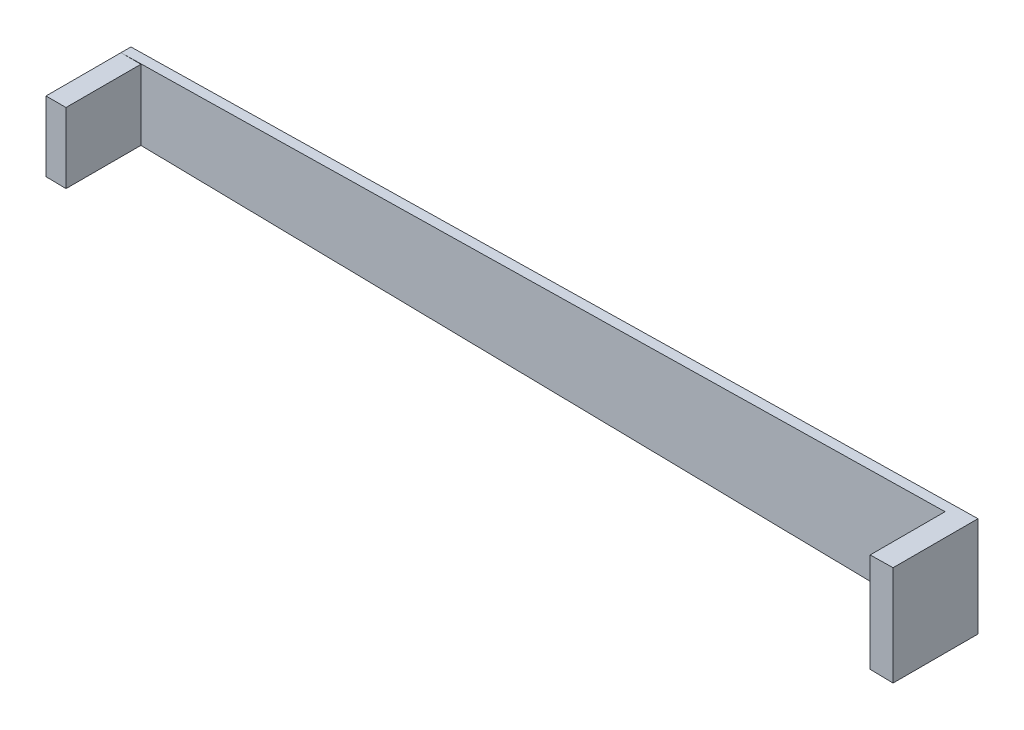
ISO-10303-21;
HEADER;
FILE_DESCRIPTION(('STEP AP214'),'2;1');
FILE_NAME('part.step','',(''),(''),'','','');
FILE_SCHEMA(('AUTOMOTIVE_DESIGN { 1 0 10303 214 1 1 1 1 }'));
ENDSEC;
DATA;
#1=APPLICATION_CONTEXT('core data for automotive mechanical design processes');
#2=APPLICATION_PROTOCOL_DEFINITION('international standard','automotive_design',2000,#1);
#3=PRODUCT_CONTEXT('',#1,'mechanical');
#4=PRODUCT('Part','Part','',(#3));
#5=PRODUCT_RELATED_PRODUCT_CATEGORY('part','',(#4));
#6=PRODUCT_DEFINITION_FORMATION('','',#4);
#7=PRODUCT_DEFINITION_CONTEXT('part definition',#1,'design');
#8=PRODUCT_DEFINITION('design','',#6,#7);
#9=PRODUCT_DEFINITION_SHAPE('','',#8);
#10=(LENGTH_UNIT() NAMED_UNIT(*) SI_UNIT(.MILLI.,.METRE.));
#11=(NAMED_UNIT(*) PLANE_ANGLE_UNIT() SI_UNIT($,.RADIAN.));
#12=(NAMED_UNIT(*) SI_UNIT($,.STERADIAN.) SOLID_ANGLE_UNIT());
#13=UNCERTAINTY_MEASURE_WITH_UNIT(LENGTH_MEASURE(1.E-05),#10,'distance_accuracy_value','');
#14=(GEOMETRIC_REPRESENTATION_CONTEXT(3) GLOBAL_UNCERTAINTY_ASSIGNED_CONTEXT((#13)) GLOBAL_UNIT_ASSIGNED_CONTEXT((#10,
#11,#12)) REPRESENTATION_CONTEXT('',''));
#15=CARTESIAN_POINT('',(0.,0.,0.));
#16=DIRECTION('',(0.,0.,1.));
#17=DIRECTION('',(1.,0.,0.));
#18=AXIS2_PLACEMENT_3D('',#15,#16,#17);
#19=CARTESIAN_POINT('',(0.,0.,2.));
#20=DIRECTION('',(0.,0.,-1.));
#21=DIRECTION('',(-1.,0.,0.));
#22=AXIS2_PLACEMENT_3D('',#19,#20,#21);
#23=PLANE('',#22);
#24=DIRECTION('',(0.,-1.,0.));
#25=VECTOR('',#24,1.);
#26=CARTESIAN_POINT('',(95.1600000000001,0.,2.));
#27=LINE('',#26,#25);
#28=CARTESIAN_POINT('',(95.1600000000001,9.9187969924812,2.));
#29=VERTEX_POINT('',#28);
#30=CARTESIAN_POINT('',(95.1600000000002,-9.91879699248121,2.));
#31=VERTEX_POINT('',#30);
#32=EDGE_CURVE('E57',#29,#31,#27,.T.);
#33=ORIENTED_EDGE('',*,*,#32,.F.);
#34=DIRECTION('',(-0.9998435459059,-0.0176885191668447,0.));
#35=VECTOR('',#34,1.);
#36=CARTESIAN_POINT('',(-69.8250000000001,7.,2.));
#37=LINE('',#36,#35);
#38=CARTESIAN_POINT('',(-69.8250000000001,7.,2.));
#39=VERTEX_POINT('',#38);
#40=EDGE_CURVE('E133',#29,#39,#37,.T.);
#41=ORIENTED_EDGE('',*,*,#40,.T.);
#42=DIRECTION('',(1.,0.,0.));
#43=VECTOR('',#42,1.);
#44=CARTESIAN_POINT('',(0.,7.,2.));
#45=LINE('',#44,#43);
#46=CARTESIAN_POINT('',(-65.8250000000001,7.,2.));
#47=VERTEX_POINT('',#46);
#48=EDGE_CURVE('E139',#39,#47,#45,.T.);
#49=ORIENTED_EDGE('',*,*,#48,.T.);
#50=DIRECTION('',(0.,-1.,0.));
#51=VECTOR('',#50,1.);
#52=CARTESIAN_POINT('',(-65.8250000000001,0.,2.));
#53=LINE('',#52,#51);
#54=CARTESIAN_POINT('',(-65.8250000000001,-7.07076514816453,2.));
#55=VERTEX_POINT('',#54);
#56=EDGE_CURVE('E135',#47,#55,#53,.T.);
#57=ORIENTED_EDGE('',*,*,#56,.T.);
#58=DIRECTION('',(0.9998435459059,-0.0176885191668448,0.));
#59=VECTOR('',#58,1.);
#60=CARTESIAN_POINT('',(-69.8250000000001,-7.,2.));
#61=LINE('',#60,#59);
#62=EDGE_CURVE('E62',#55,#31,#61,.T.);
#63=ORIENTED_EDGE('',*,*,#62,.T.);
#64=EDGE_LOOP('',(#33,#41,#49,#57,#63));
#65=FACE_BOUND('',#64,.T.);
#66=ADVANCED_FACE('F41',(#65),#23,.F.);
#67=CARTESIAN_POINT('',(99.7500000000001,-10.,2.));
#68=DIRECTION('',(-1.,0.,0.));
#69=DIRECTION('',(0.,0.,1.));
#70=AXIS2_PLACEMENT_3D('',#67,#68,#69);
#71=PLANE('',#70);
#72=DIRECTION('',(0.,1.,0.));
#73=VECTOR('',#72,1.);
#74=CARTESIAN_POINT('',(99.7500000000001,-10.,0.));
#75=LINE('',#74,#73);
#76=CARTESIAN_POINT('',(99.7500000000001,-10.,0.));
#77=VERTEX_POINT('',#76);
#78=CARTESIAN_POINT('',(99.7500000000001,10.,0.));
#79=VERTEX_POINT('',#78);
#80=EDGE_CURVE('E173',#77,#79,#75,.T.);
#81=ORIENTED_EDGE('',*,*,#80,.T.);
#82=DIRECTION('',(0.,0.,-1.));
#83=VECTOR('',#82,1.);
#84=CARTESIAN_POINT('',(99.7500000000001,10.,2.));
#85=LINE('',#84,#83);
#86=CARTESIAN_POINT('',(99.7500000000001,10.,17.));
#87=VERTEX_POINT('',#86);
#88=EDGE_CURVE('E11',#87,#79,#85,.T.);
#89=ORIENTED_EDGE('',*,*,#88,.F.);
#90=DIRECTION('',(0.,1.,0.));
#91=VECTOR('',#90,1.);
#92=CARTESIAN_POINT('',(99.7500000000001,0.,17.));
#93=LINE('',#92,#91);
#94=CARTESIAN_POINT('',(99.7500000000001,-10.,17.));
#95=VERTEX_POINT('',#94);
#96=EDGE_CURVE('E127',#95,#87,#93,.T.);
#97=ORIENTED_EDGE('',*,*,#96,.F.);
#98=DIRECTION('',(0.,0.,-1.));
#99=VECTOR('',#98,1.);
#100=CARTESIAN_POINT('',(99.7500000000001,-10.,2.));
#101=LINE('',#100,#99);
#102=EDGE_CURVE('E179',#95,#77,#101,.T.);
#103=ORIENTED_EDGE('',*,*,#102,.T.);
#104=EDGE_LOOP('',(#81,#89,#97,#103));
#105=FACE_BOUND('',#104,.T.);
#106=ADVANCED_FACE('F43',(#105),#71,.F.);
#107=CARTESIAN_POINT('',(-69.8250000000001,7.,2.));
#108=DIRECTION('',(0.0176885191668447,-0.9998435459059,0.));
#109=DIRECTION('',(0.9998435459059,0.0176885191668447,0.));
#110=AXIS2_PLACEMENT_3D('',#107,#108,#109);
#111=PLANE('',#110);
#112=DIRECTION('',(-0.9998435459059,-0.0176885191668447,0.));
#113=VECTOR('',#112,1.);
#114=CARTESIAN_POINT('',(-69.8250000000001,7.,0.));
#115=LINE('',#114,#113);
#116=CARTESIAN_POINT('',(-69.8250000000001,7.,0.));
#117=VERTEX_POINT('',#116);
#118=EDGE_CURVE('E183',#79,#117,#115,.T.);
#119=ORIENTED_EDGE('',*,*,#118,.T.);
#120=DIRECTION('',(0.,0.,-1.));
#121=VECTOR('',#120,1.);
#122=CARTESIAN_POINT('',(-69.8250000000001,7.,2.));
#123=LINE('',#122,#121);
#124=EDGE_CURVE('E50',#39,#117,#123,.T.);
#125=ORIENTED_EDGE('',*,*,#124,.F.);
#126=ORIENTED_EDGE('',*,*,#40,.F.);
#127=DIRECTION('',(0.,0.,-1.));
#128=VECTOR('',#127,1.);
#129=CARTESIAN_POINT('',(95.1600000000001,9.9187969924812,17.));
#130=LINE('',#129,#128);
#131=CARTESIAN_POINT('',(95.1600000000001,9.9187969924812,17.));
#132=VERTEX_POINT('',#131);
#133=EDGE_CURVE('E113',#132,#29,#130,.T.);
#134=ORIENTED_EDGE('',*,*,#133,.F.);
#135=DIRECTION('',(-0.9998435459059,-0.0176885191668447,0.));
#136=VECTOR('',#135,1.);
#137=CARTESIAN_POINT('',(-0.145647367152021,8.23271742826799,17.));
#138=LINE('',#137,#136);
#139=EDGE_CURVE('E121',#87,#132,#138,.T.);
#140=ORIENTED_EDGE('',*,*,#139,.F.);
#141=ORIENTED_EDGE('',*,*,#88,.T.);
#142=EDGE_LOOP('',(#119,#125,#126,#134,#140,#141));
#143=FACE_BOUND('',#142,.T.);
#144=ADVANCED_FACE('F131',(#143),#111,.F.);
#145=CARTESIAN_POINT('',(-69.8250000000001,-7.,2.));
#146=DIRECTION('',(1.,0.,0.));
#147=DIRECTION('',(0.,0.,-1.));
#148=AXIS2_PLACEMENT_3D('',#145,#146,#147);
#149=PLANE('',#148);
#150=DIRECTION('',(0.,-1.,0.));
#151=VECTOR('',#150,1.);
#152=CARTESIAN_POINT('',(-69.8250000000001,-7.,0.));
#153=LINE('',#152,#151);
#154=CARTESIAN_POINT('',(-69.8250000000001,-7.,0.));
#155=VERTEX_POINT('',#154);
#156=EDGE_CURVE('E186',#117,#155,#153,.T.);
#157=ORIENTED_EDGE('',*,*,#156,.T.);
#158=DIRECTION('',(0.,0.,-1.));
#159=VECTOR('',#158,1.);
#160=CARTESIAN_POINT('',(-69.8250000000001,-7.,2.));
#161=LINE('',#160,#159);
#162=CARTESIAN_POINT('',(-69.8250000000001,-7.,17.));
#163=VERTEX_POINT('',#162);
#164=EDGE_CURVE('E194',#163,#155,#161,.T.);
#165=ORIENTED_EDGE('',*,*,#164,.F.);
#166=DIRECTION('',(0.,-1.,0.));
#167=VECTOR('',#166,1.);
#168=CARTESIAN_POINT('',(-69.8250000000001,0.,17.));
#169=LINE('',#168,#167);
#170=CARTESIAN_POINT('',(-69.8250000000001,7.,17.));
#171=VERTEX_POINT('',#170);
#172=EDGE_CURVE('E152',#171,#163,#169,.T.);
#173=ORIENTED_EDGE('',*,*,#172,.F.);
#174=DIRECTION('',(0.,0.,-1.));
#175=VECTOR('',#174,1.);
#176=CARTESIAN_POINT('',(-69.8250000000001,7.,17.));
#177=LINE('',#176,#175);
#178=EDGE_CURVE('E165',#171,#39,#177,.T.);
#179=ORIENTED_EDGE('',*,*,#178,.T.);
#180=ORIENTED_EDGE('',*,*,#124,.T.);
#181=EDGE_LOOP('',(#157,#165,#173,#179,#180));
#182=FACE_BOUND('',#181,.T.);
#183=ADVANCED_FACE('F201',(#182),#149,.F.);
#184=CARTESIAN_POINT('',(-69.8250000000001,-7.,2.));
#185=DIRECTION('',(0.0176885191668448,0.9998435459059,0.));
#186=DIRECTION('',(-0.9998435459059,0.0176885191668448,0.));
#187=AXIS2_PLACEMENT_3D('',#184,#185,#186);
#188=PLANE('',#187);
#189=DIRECTION('',(0.9998435459059,-0.0176885191668448,0.));
#190=VECTOR('',#189,1.);
#191=CARTESIAN_POINT('',(-69.8250000000001,-7.,0.));
#192=LINE('',#191,#190);
#193=EDGE_CURVE('E176',#155,#77,#192,.T.);
#194=ORIENTED_EDGE('',*,*,#193,.T.);
#195=ORIENTED_EDGE('',*,*,#102,.F.);
#196=DIRECTION('',(0.9998435459059,-0.0176885191668448,0.));
#197=VECTOR('',#196,1.);
#198=CARTESIAN_POINT('',(-0.145647367152021,-8.23271742826799,17.));
#199=LINE('',#198,#197);
#200=CARTESIAN_POINT('',(95.1600000000001,-9.91879699248121,17.));
#201=VERTEX_POINT('',#200);
#202=EDGE_CURVE('E120',#201,#95,#199,.T.);
#203=ORIENTED_EDGE('',*,*,#202,.F.);
#204=DIRECTION('',(0.,0.,-1.));
#205=VECTOR('',#204,1.);
#206=CARTESIAN_POINT('',(95.1600000000001,-9.91879699248121,17.));
#207=LINE('',#206,#205);
#208=EDGE_CURVE('E115',#201,#31,#207,.T.);
#209=ORIENTED_EDGE('',*,*,#208,.T.);
#210=ORIENTED_EDGE('',*,*,#62,.F.);
#211=DIRECTION('',(0.,0.,-1.));
#212=VECTOR('',#211,1.);
#213=CARTESIAN_POINT('',(-65.8250000000001,-7.07076514816453,17.));
#214=LINE('',#213,#212);
#215=CARTESIAN_POINT('',(-65.8250000000001,-7.07076514816453,17.));
#216=VERTEX_POINT('',#215);
#217=EDGE_CURVE('E158',#216,#55,#214,.T.);
#218=ORIENTED_EDGE('',*,*,#217,.F.);
#219=DIRECTION('',(0.9998435459059,-0.0176885191668448,0.));
#220=VECTOR('',#219,1.);
#221=CARTESIAN_POINT('',(-0.145647367152021,-8.23271742826799,17.));
#222=LINE('',#221,#220);
#223=EDGE_CURVE('E156',#163,#216,#222,.T.);
#224=ORIENTED_EDGE('',*,*,#223,.F.);
#225=ORIENTED_EDGE('',*,*,#164,.T.);
#226=EDGE_LOOP('',(#194,#195,#203,#209,#210,#218,#224,#225));
#227=FACE_BOUND('',#226,.T.);
#228=ADVANCED_FACE('F209',(#227),#188,.F.);
#229=CARTESIAN_POINT('',(0.,0.,0.));
#230=DIRECTION('',(0.,0.,-1.));
#231=DIRECTION('',(-1.,0.,0.));
#232=AXIS2_PLACEMENT_3D('',#229,#230,#231);
#233=PLANE('',#232);
#234=ORIENTED_EDGE('',*,*,#80,.F.);
#235=ORIENTED_EDGE('',*,*,#193,.F.);
#236=ORIENTED_EDGE('',*,*,#156,.F.);
#237=ORIENTED_EDGE('',*,*,#118,.F.);
#238=EDGE_LOOP('',(#234,#235,#236,#237));
#239=FACE_BOUND('',#238,.T.);
#240=ADVANCED_FACE('F207',(#239),#233,.T.);
#241=CARTESIAN_POINT('',(-65.8250000000001,0.,17.));
#242=DIRECTION('',(1.,0.,0.));
#243=DIRECTION('',(0.,0.,-1.));
#244=AXIS2_PLACEMENT_3D('',#241,#242,#243);
#245=PLANE('',#244);
#246=ORIENTED_EDGE('',*,*,#56,.F.);
#247=DIRECTION('',(0.,0.,-1.));
#248=VECTOR('',#247,1.);
#249=CARTESIAN_POINT('',(-65.8250000000001,7.,17.));
#250=LINE('',#249,#248);
#251=CARTESIAN_POINT('',(-65.8250000000001,7.,17.));
#252=VERTEX_POINT('',#251);
#253=EDGE_CURVE('E169',#252,#47,#250,.T.);
#254=ORIENTED_EDGE('',*,*,#253,.F.);
#255=DIRECTION('',(0.,-1.,0.));
#256=VECTOR('',#255,1.);
#257=CARTESIAN_POINT('',(-65.8250000000001,0.,17.));
#258=LINE('',#257,#256);
#259=EDGE_CURVE('E144',#252,#216,#258,.T.);
#260=ORIENTED_EDGE('',*,*,#259,.T.);
#261=ORIENTED_EDGE('',*,*,#217,.T.);
#262=EDGE_LOOP('',(#246,#254,#260,#261));
#263=FACE_BOUND('',#262,.T.);
#264=ADVANCED_FACE('F220',(#263),#245,.T.);
#265=CARTESIAN_POINT('',(0.,7.,17.));
#266=DIRECTION('',(0.,1.,0.));
#267=DIRECTION('',(0.,0.,1.));
#268=AXIS2_PLACEMENT_3D('',#265,#266,#267);
#269=PLANE('',#268);
#270=ORIENTED_EDGE('',*,*,#48,.F.);
#271=ORIENTED_EDGE('',*,*,#178,.F.);
#272=DIRECTION('',(1.,0.,0.));
#273=VECTOR('',#272,1.);
#274=CARTESIAN_POINT('',(0.,7.,17.));
#275=LINE('',#274,#273);
#276=EDGE_CURVE('E148',#171,#252,#275,.T.);
#277=ORIENTED_EDGE('',*,*,#276,.T.);
#278=ORIENTED_EDGE('',*,*,#253,.T.);
#279=EDGE_LOOP('',(#270,#271,#277,#278));
#280=FACE_BOUND('',#279,.T.);
#281=ADVANCED_FACE('F225',(#280),#269,.T.);
#282=CARTESIAN_POINT('',(0.,0.,17.));
#283=DIRECTION('',(0.,0.,1.));
#284=DIRECTION('',(1.,0.,0.));
#285=AXIS2_PLACEMENT_3D('',#282,#283,#284);
#286=PLANE('',#285);
#287=ORIENTED_EDGE('',*,*,#259,.F.);
#288=ORIENTED_EDGE('',*,*,#276,.F.);
#289=ORIENTED_EDGE('',*,*,#172,.T.);
#290=ORIENTED_EDGE('',*,*,#223,.T.);
#291=EDGE_LOOP('',(#287,#288,#289,#290));
#292=FACE_BOUND('',#291,.T.);
#293=ADVANCED_FACE('F223',(#292),#286,.T.);
#294=CARTESIAN_POINT('',(95.1600000000001,0.,17.));
#295=DIRECTION('',(1.,0.,0.));
#296=DIRECTION('',(0.,1.,0.));
#297=AXIS2_PLACEMENT_3D('',#294,#295,#296);
#298=PLANE('',#297);
#299=ORIENTED_EDGE('',*,*,#32,.T.);
#300=ORIENTED_EDGE('',*,*,#208,.F.);
#301=DIRECTION('',(0.,-1.,0.));
#302=VECTOR('',#301,1.);
#303=CARTESIAN_POINT('',(95.1600000000001,0.,17.));
#304=LINE('',#303,#302);
#305=EDGE_CURVE('E109',#132,#201,#304,.T.);
#306=ORIENTED_EDGE('',*,*,#305,.F.);
#307=ORIENTED_EDGE('',*,*,#133,.T.);
#308=EDGE_LOOP('',(#299,#300,#306,#307));
#309=FACE_BOUND('',#308,.T.);
#310=ADVANCED_FACE('F111',(#309),#298,.F.);
#311=CARTESIAN_POINT('',(0.,0.,17.));
#312=DIRECTION('',(0.,0.,1.));
#313=DIRECTION('',(1.,0.,0.));
#314=AXIS2_PLACEMENT_3D('',#311,#312,#313);
#315=PLANE('',#314);
#316=ORIENTED_EDGE('',*,*,#139,.T.);
#317=ORIENTED_EDGE('',*,*,#305,.T.);
#318=ORIENTED_EDGE('',*,*,#202,.T.);
#319=ORIENTED_EDGE('',*,*,#96,.T.);
#320=EDGE_LOOP('',(#316,#317,#318,#319));
#321=FACE_BOUND('',#320,.T.);
#322=ADVANCED_FACE('F125',(#321),#315,.T.);
#323=CLOSED_SHELL('',(#66,#106,#144,#183,#228,#240,#264,#281,#293,#310,#322));
#324=MANIFOLD_SOLID_BREP('B2',#323);
#325=ADVANCED_BREP_SHAPE_REPRESENTATION('',(#18,#324),#14);
#326=SHAPE_DEFINITION_REPRESENTATION(#9,#325);
ENDSEC;
END-ISO-10303-21;
